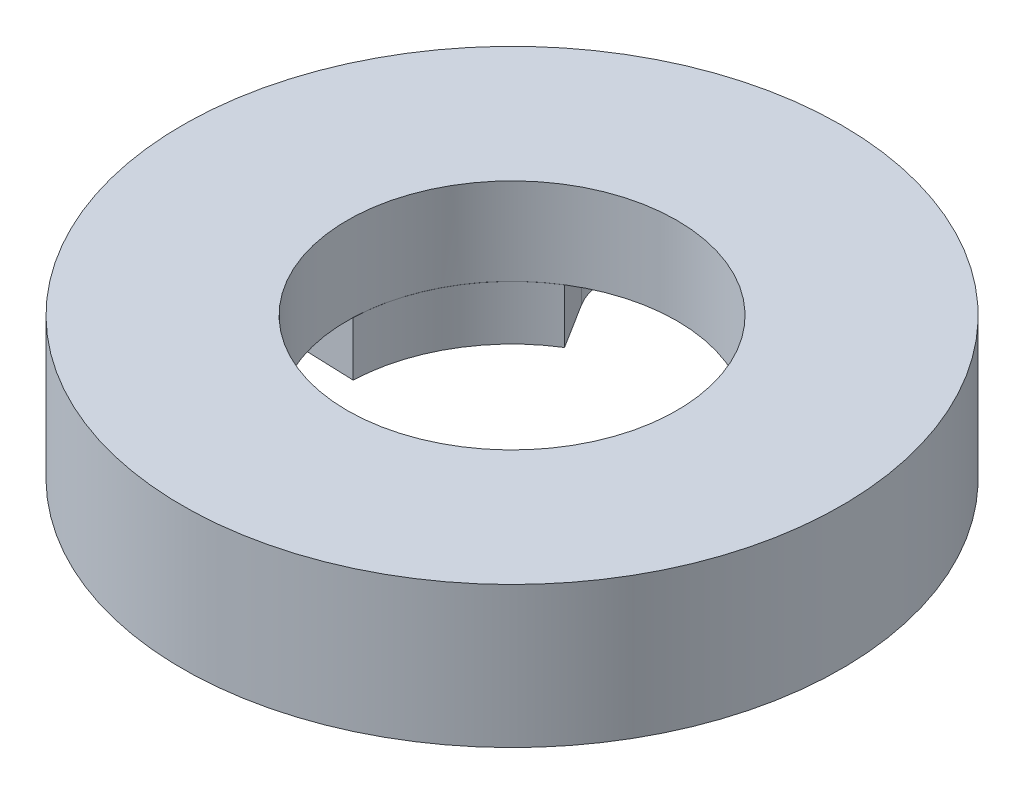
ISO-10303-21;
HEADER;
FILE_DESCRIPTION(('STEP AP214'),'2;1');
FILE_NAME('part.step','',(''),(''),'','','');
FILE_SCHEMA(('AUTOMOTIVE_DESIGN { 1 0 10303 214 1 1 1 1 }'));
ENDSEC;
DATA;
#1=APPLICATION_CONTEXT('core data for automotive mechanical design processes');
#2=APPLICATION_PROTOCOL_DEFINITION('international standard','automotive_design',2000,#1);
#3=PRODUCT_CONTEXT('',#1,'mechanical');
#4=PRODUCT('Part','Part','',(#3));
#5=PRODUCT_RELATED_PRODUCT_CATEGORY('part','',(#4));
#6=PRODUCT_DEFINITION_FORMATION('','',#4);
#7=PRODUCT_DEFINITION_CONTEXT('part definition',#1,'design');
#8=PRODUCT_DEFINITION('design','',#6,#7);
#9=PRODUCT_DEFINITION_SHAPE('','',#8);
#10=(LENGTH_UNIT() NAMED_UNIT(*) SI_UNIT(.MILLI.,.METRE.));
#11=(NAMED_UNIT(*) PLANE_ANGLE_UNIT() SI_UNIT($,.RADIAN.));
#12=(NAMED_UNIT(*) SI_UNIT($,.STERADIAN.) SOLID_ANGLE_UNIT());
#13=UNCERTAINTY_MEASURE_WITH_UNIT(LENGTH_MEASURE(1.E-05),#10,'distance_accuracy_value','');
#14=(GEOMETRIC_REPRESENTATION_CONTEXT(3) GLOBAL_UNCERTAINTY_ASSIGNED_CONTEXT((#13)) GLOBAL_UNIT_ASSIGNED_CONTEXT((#10,
#11,#12)) REPRESENTATION_CONTEXT('',''));
#15=CARTESIAN_POINT('',(0.,0.,0.));
#16=DIRECTION('',(0.,0.,1.));
#17=DIRECTION('',(1.,0.,0.));
#18=AXIS2_PLACEMENT_3D('',#15,#16,#17);
#19=CARTESIAN_POINT('',(0.,-5.8674,0.));
#20=DIRECTION('',(0.,1.,0.));
#21=DIRECTION('',(0.,0.,1.));
#22=AXIS2_PLACEMENT_3D('',#19,#20,#21);
#23=PLANE('',#22);
#24=CARTESIAN_POINT('',(0.,-5.8674,0.));
#25=DIRECTION('',(0.,-1.,0.));
#26=DIRECTION('',(0.,0.,-1.));
#27=AXIS2_PLACEMENT_3D('',#24,#25,#26);
#28=CIRCLE('',#27,11.1125);
#29=CARTESIAN_POINT('',(11.1057305652497,-5.8674,-0.387820657106539));
#30=VERTEX_POINT('',#29);
#31=CARTESIAN_POINT('',(5.8887278237915,-5.8674,-9.42393446853828));
#32=VERTEX_POINT('',#31);
#33=EDGE_CURVE('E321',#30,#32,#28,.F.);
#34=ORIENTED_EDGE('',*,*,#33,.T.);
#35=DIRECTION('',(-0.529919264233206,0.,0.848048096156426));
#36=VECTOR('',#35,1.);
#37=CARTESIAN_POINT('',(2.15404216423732,-5.8674,-3.44718805243929));
#38=LINE('',#37,#36);
#39=CARTESIAN_POINT('',(5.88536283646362,-5.8674,-9.41854936312769));
#40=VERTEX_POINT('',#39);
#41=EDGE_CURVE('E191',#40,#32,#38,.F.);
#42=ORIENTED_EDGE('',*,*,#41,.F.);
#43=CARTESIAN_POINT('',(0.,-5.8674,0.));
#44=DIRECTION('',(0.,1.,0.));
#45=DIRECTION('',(0.,0.,1.));
#46=AXIS2_PLACEMENT_3D('',#43,#44,#45);
#47=CIRCLE('',#46,11.10615);
#48=CARTESIAN_POINT('',(11.0993844334981,-5.8674,-0.387599045302477));
#49=VERTEX_POINT('',#48);
#50=EDGE_CURVE('E181',#40,#49,#47,.F.);
#51=ORIENTED_EDGE('',*,*,#50,.T.);
#52=DIRECTION('',(0.999390827019096,0.,-0.0348994967025008));
#53=VECTOR('',#52,1.);
#54=CARTESIAN_POINT('',(19.0383952547138,-5.8674,-0.664835412182639));
#55=LINE('',#54,#53);
#56=EDGE_CURVE('E175',#30,#49,#55,.F.);
#57=ORIENTED_EDGE('',*,*,#56,.F.);
#58=EDGE_LOOP('',(#34,#42,#51,#57));
#59=FACE_BOUND('',#58,.T.);
#60=ADVANCED_FACE('F17',(#59),#23,.T.);
#61=CARTESIAN_POINT('',(0.,-5.8674,0.));
#62=DIRECTION('',(0.,1.,0.));
#63=DIRECTION('',(0.,0.,1.));
#64=AXIS2_PLACEMENT_3D('',#61,#62,#63);
#65=PLANE('',#64);
#66=CARTESIAN_POINT('',(4.58846068229295,-5.8674,-14.5328465404081));
#67=DIRECTION('',(0.,-1.,0.));
#68=DIRECTION('',(0.,0.,-1.));
#69=AXIS2_PLACEMENT_3D('',#66,#67,#68);
#70=CIRCLE('',#69,3.81);
#71=CARTESIAN_POINT('',(5.73557585286619,-5.8674,-18.1660581755101));
#72=VERTEX_POINT('',#71);
#73=CARTESIAN_POINT('',(7.81952392864893,-5.8674,-12.5138541436796));
#74=VERTEX_POINT('',#73);
#75=EDGE_CURVE('E199',#72,#74,#70,.T.);
#76=ORIENTED_EDGE('',*,*,#75,.T.);
#77=DIRECTION('',(-0.529919264233206,0.,0.848048096156426));
#78=VECTOR('',#77,1.);
#79=CARTESIAN_POINT('',(2.15404216423732,-5.8674,-3.44718805243929));
#80=LINE('',#79,#78);
#81=EDGE_CURVE('E195',#32,#74,#80,.F.);
#82=ORIENTED_EDGE('',*,*,#81,.F.);
#83=CARTESIAN_POINT('',(0.,-5.8674,0.));
#84=DIRECTION('',(0.,-1.,0.));
#85=DIRECTION('',(0.,0.,-1.));
#86=AXIS2_PLACEMENT_3D('',#83,#84,#85);
#87=CIRCLE('',#86,11.1125);
#88=CARTESIAN_POINT('',(-5.88872782379151,-5.8674,-9.42393446853827));
#89=VERTEX_POINT('',#88);
#90=EDGE_CURVE('E318',#32,#89,#87,.F.);
#91=ORIENTED_EDGE('',*,*,#90,.T.);
#92=DIRECTION('',(-0.529919264233206,0.,-0.848048096156425));
#93=VECTOR('',#92,1.);
#94=CARTESIAN_POINT('',(-10.0949619836426,-5.8674,-16.1553162317799));
#95=LINE('',#94,#93);
#96=CARTESIAN_POINT('',(-7.81952392864895,-5.8674,-12.5138541436796));
#97=VERTEX_POINT('',#96);
#98=EDGE_CURVE('E258',#97,#89,#95,.F.);
#99=ORIENTED_EDGE('',*,*,#98,.F.);
#100=CARTESIAN_POINT('',(-4.58846068229295,-5.8674,-14.5328465404081));
#101=DIRECTION('',(0.,-1.,0.));
#102=DIRECTION('',(0.,0.,-1.));
#103=AXIS2_PLACEMENT_3D('',#100,#101,#102);
#104=CIRCLE('',#103,3.81);
#105=CARTESIAN_POINT('',(-5.7355758528662,-5.8674,-18.1660581755101));
#106=VERTEX_POINT('',#105);
#107=EDGE_CURVE('E204',#97,#106,#104,.T.);
#108=ORIENTED_EDGE('',*,*,#107,.T.);
#109=CARTESIAN_POINT('',(0.,-5.8674,0.));
#110=DIRECTION('',(0.,-1.,0.));
#111=DIRECTION('',(0.,0.,-1.));
#112=AXIS2_PLACEMENT_3D('',#109,#110,#111);
#113=CIRCLE('',#112,19.05);
#114=EDGE_CURVE('E200',#106,#72,#113,.T.);
#115=ORIENTED_EDGE('',*,*,#114,.T.);
#116=EDGE_LOOP('',(#76,#82,#91,#99,#108,#115));
#117=FACE_BOUND('',#116,.T.);
#118=ADVANCED_FACE('F380',(#117),#65,.F.);
#119=CARTESIAN_POINT('',(0.,-5.8674,0.));
#120=DIRECTION('',(0.,1.,0.));
#121=DIRECTION('',(0.,0.,1.));
#122=AXIS2_PLACEMENT_3D('',#119,#120,#121);
#123=PLANE('',#122);
#124=CARTESIAN_POINT('',(0.,-5.8674,0.));
#125=DIRECTION('',(0.,-1.,0.));
#126=DIRECTION('',(0.,0.,-1.));
#127=AXIS2_PLACEMENT_3D('',#124,#125,#126);
#128=CIRCLE('',#127,11.1125);
#129=CARTESIAN_POINT('',(-11.1057305652497,-5.8674,-0.387820657106539));
#130=VERTEX_POINT('',#129);
#131=EDGE_CURVE('E315',#89,#130,#128,.F.);
#132=ORIENTED_EDGE('',*,*,#131,.T.);
#133=DIRECTION('',(0.999390827019096,0.,0.0348994967025009));
#134=VECTOR('',#133,1.);
#135=CARTESIAN_POINT('',(-4.0623735071533,-5.8674,-0.141861208832684));
#136=LINE('',#135,#134);
#137=CARTESIAN_POINT('',(-11.0993844334981,-5.8674,-0.387599045302481));
#138=VERTEX_POINT('',#137);
#139=EDGE_CURVE('E216',#138,#130,#136,.F.);
#140=ORIENTED_EDGE('',*,*,#139,.F.);
#141=CARTESIAN_POINT('',(0.,-5.8674,0.));
#142=DIRECTION('',(0.,1.,0.));
#143=DIRECTION('',(0.,0.,1.));
#144=AXIS2_PLACEMENT_3D('',#141,#142,#143);
#145=CIRCLE('',#144,11.10615);
#146=CARTESIAN_POINT('',(-5.88536283646364,-5.8674,-9.41854936312767));
#147=VERTEX_POINT('',#146);
#148=EDGE_CURVE('E215',#138,#147,#145,.F.);
#149=ORIENTED_EDGE('',*,*,#148,.T.);
#150=DIRECTION('',(-0.529919264233206,0.,-0.848048096156425));
#151=VECTOR('',#150,1.);
#152=CARTESIAN_POINT('',(-10.0949619836426,-5.8674,-16.1553162317799));
#153=LINE('',#152,#151);
#154=EDGE_CURVE('E211',#89,#147,#153,.F.);
#155=ORIENTED_EDGE('',*,*,#154,.F.);
#156=EDGE_LOOP('',(#132,#140,#149,#155));
#157=FACE_BOUND('',#156,.T.);
#158=ADVANCED_FACE('F364',(#157),#123,.T.);
#159=CARTESIAN_POINT('',(0.,-5.8674,0.));
#160=DIRECTION('',(0.,1.,0.));
#161=DIRECTION('',(0.,0.,1.));
#162=AXIS2_PLACEMENT_3D('',#159,#160,#161);
#163=PLANE('',#162);
#164=CARTESIAN_POINT('',(-10.2915839521477,-5.8674,11.2401467853358));
#165=DIRECTION('',(0.,-1.,0.));
#166=DIRECTION('',(0.,0.,-1.));
#167=AXIS2_PLACEMENT_3D('',#164,#165,#166);
#168=CIRCLE('',#167,3.81);
#169=CARTESIAN_POINT('',(-6.92755362335522,-5.8674,13.0288334395501));
#170=VERTEX_POINT('',#169);
#171=CARTESIAN_POINT('',(-12.8644799401847,-5.8674,14.0501834816698));
#172=VERTEX_POINT('',#171);
#173=EDGE_CURVE('E229',#170,#172,#168,.T.);
#174=ORIENTED_EDGE('',*,*,#173,.T.);
#175=CARTESIAN_POINT('',(0.,-5.8674,0.));
#176=DIRECTION('',(0.,-1.,0.));
#177=DIRECTION('',(0.,0.,-1.));
#178=AXIS2_PLACEMENT_3D('',#175,#176,#177);
#179=CIRCLE('',#178,19.05);
#180=CARTESIAN_POINT('',(-18.6000557930509,-5.8674,4.11587469384037));
#181=VERTEX_POINT('',#180);
#182=EDGE_CURVE('E225',#172,#181,#179,.T.);
#183=ORIENTED_EDGE('',*,*,#182,.T.);
#184=CARTESIAN_POINT('',(-14.8800446344407,-5.8674,3.29269975507229));
#185=DIRECTION('',(0.,-1.,0.));
#186=DIRECTION('',(0.,0.,-1.));
#187=AXIS2_PLACEMENT_3D('',#184,#185,#186);
#188=CIRCLE('',#187,3.81);
#189=CARTESIAN_POINT('',(-14.7470775520042,-5.8674,-0.514979295870466));
#190=VERTEX_POINT('',#189);
#191=EDGE_CURVE('E224',#181,#190,#188,.T.);
#192=ORIENTED_EDGE('',*,*,#191,.T.);
#193=DIRECTION('',(0.999390827019096,0.,0.0348994967025009));
#194=VECTOR('',#193,1.);
#195=CARTESIAN_POINT('',(-4.0623735071533,-5.8674,-0.141861208832684));
#196=LINE('',#195,#194);
#197=EDGE_CURVE('E220',#130,#190,#196,.F.);
#198=ORIENTED_EDGE('',*,*,#197,.F.);
#199=CARTESIAN_POINT('',(0.,-5.8674,0.));
#200=DIRECTION('',(0.,-1.,0.));
#201=DIRECTION('',(0.,0.,-1.));
#202=AXIS2_PLACEMENT_3D('',#199,#200,#201);
#203=CIRCLE('',#202,11.1125);
#204=CARTESIAN_POINT('',(-5.21700274145821,-5.8674,9.81175512564482));
#205=VERTEX_POINT('',#204);
#206=EDGE_CURVE('E312',#130,#205,#203,.F.);
#207=ORIENTED_EDGE('',*,*,#206,.T.);
#208=DIRECTION('',(-0.469471562785891,0.,0.882947592858927));
#209=VECTOR('',#208,1.);
#210=CARTESIAN_POINT('',(-1.90833134291598,-5.8674,3.58904926127198));
#211=LINE('',#210,#209);
#212=EDGE_CURVE('E240',#170,#205,#211,.F.);
#213=ORIENTED_EDGE('',*,*,#212,.F.);
#214=EDGE_LOOP('',(#174,#183,#192,#198,#207,#213));
#215=FACE_BOUND('',#214,.T.);
#216=ADVANCED_FACE('F361',(#215),#163,.F.);
#217=CARTESIAN_POINT('',(0.,-5.8674,0.));
#218=DIRECTION('',(0.,1.,0.));
#219=DIRECTION('',(0.,0.,1.));
#220=AXIS2_PLACEMENT_3D('',#217,#218,#219);
#221=PLANE('',#220);
#222=CARTESIAN_POINT('',(0.,-5.8674,0.));
#223=DIRECTION('',(0.,-1.,0.));
#224=DIRECTION('',(0.,0.,-1.));
#225=AXIS2_PLACEMENT_3D('',#222,#223,#224);
#226=CIRCLE('',#225,11.1125);
#227=CARTESIAN_POINT('',(5.2170027414582,-5.8674,9.81175512564483));
#228=VERTEX_POINT('',#227);
#229=EDGE_CURVE('E309',#205,#228,#226,.F.);
#230=ORIENTED_EDGE('',*,*,#229,.T.);
#231=DIRECTION('',(-0.46947156278589,0.,-0.882947592858927));
#232=VECTOR('',#231,1.);
#233=CARTESIAN_POINT('',(8.94343327107121,-5.8674,16.8201516439626));
#234=LINE('',#233,#232);
#235=CARTESIAN_POINT('',(5.21402159703451,-5.8674,9.80614840843018));
#236=VERTEX_POINT('',#235);
#237=EDGE_CURVE('E245',#236,#228,#234,.F.);
#238=ORIENTED_EDGE('',*,*,#237,.F.);
#239=CARTESIAN_POINT('',(0.,-5.8674,0.));
#240=DIRECTION('',(0.,1.,0.));
#241=DIRECTION('',(0.,0.,1.));
#242=AXIS2_PLACEMENT_3D('',#239,#240,#241);
#243=CIRCLE('',#242,11.10615);
#244=CARTESIAN_POINT('',(-5.21402159703452,-5.8674,9.80614840843016));
#245=VERTEX_POINT('',#244);
#246=EDGE_CURVE('E241',#236,#245,#243,.F.);
#247=ORIENTED_EDGE('',*,*,#246,.T.);
#248=DIRECTION('',(-0.469471562785891,0.,0.882947592858927));
#249=VECTOR('',#248,1.);
#250=CARTESIAN_POINT('',(-1.90833134291598,-5.8674,3.58904926127198));
#251=LINE('',#250,#249);
#252=EDGE_CURVE('E236',#205,#245,#251,.F.);
#253=ORIENTED_EDGE('',*,*,#252,.F.);
#254=EDGE_LOOP('',(#230,#238,#247,#253));
#255=FACE_BOUND('',#254,.T.);
#256=ADVANCED_FACE('F352',(#255),#221,.T.);
#257=CARTESIAN_POINT('',(0.,-5.8674,0.));
#258=DIRECTION('',(0.,1.,0.));
#259=DIRECTION('',(0.,0.,1.));
#260=AXIS2_PLACEMENT_3D('',#257,#258,#259);
#261=PLANE('',#260);
#262=CARTESIAN_POINT('',(10.2915839521477,-5.8674,11.2401467853358));
#263=DIRECTION('',(0.,-1.,0.));
#264=DIRECTION('',(0.,0.,-1.));
#265=AXIS2_PLACEMENT_3D('',#262,#263,#264);
#266=CIRCLE('',#265,3.81);
#267=CARTESIAN_POINT('',(12.8644799401847,-5.8674,14.0501834816698));
#268=VERTEX_POINT('',#267);
#269=CARTESIAN_POINT('',(6.92755362335521,-5.8674,13.0288334395501));
#270=VERTEX_POINT('',#269);
#271=EDGE_CURVE('E250',#268,#270,#266,.T.);
#272=ORIENTED_EDGE('',*,*,#271,.T.);
#273=DIRECTION('',(-0.46947156278589,0.,-0.882947592858927));
#274=VECTOR('',#273,1.);
#275=CARTESIAN_POINT('',(8.94343327107121,-5.8674,16.8201516439626));
#276=LINE('',#275,#274);
#277=EDGE_CURVE('E246',#228,#270,#276,.F.);
#278=ORIENTED_EDGE('',*,*,#277,.F.);
#279=CARTESIAN_POINT('',(0.,-5.8674,0.));
#280=DIRECTION('',(0.,-1.,0.));
#281=DIRECTION('',(0.,0.,-1.));
#282=AXIS2_PLACEMENT_3D('',#279,#280,#281);
#283=CIRCLE('',#282,11.1125);
#284=EDGE_CURVE('E172',#228,#30,#283,.F.);
#285=ORIENTED_EDGE('',*,*,#284,.T.);
#286=DIRECTION('',(0.999390827019096,0.,-0.0348994967025008));
#287=VECTOR('',#286,1.);
#288=CARTESIAN_POINT('',(19.0383952547138,-5.8674,-0.664835412182639));
#289=LINE('',#288,#287);
#290=CARTESIAN_POINT('',(14.7470775520041,-5.8674,-0.514979295870459));
#291=VERTEX_POINT('',#290);
#292=EDGE_CURVE('E169',#291,#30,#289,.F.);
#293=ORIENTED_EDGE('',*,*,#292,.F.);
#294=CARTESIAN_POINT('',(14.8800446344407,-5.8674,3.29269975507229));
#295=DIRECTION('',(0.,-1.,0.));
#296=DIRECTION('',(0.,0.,-1.));
#297=AXIS2_PLACEMENT_3D('',#294,#295,#296);
#298=CIRCLE('',#297,3.81);
#299=CARTESIAN_POINT('',(18.6000557930509,-5.8674,4.11587469384037));
#300=VERTEX_POINT('',#299);
#301=EDGE_CURVE('E20',#291,#300,#298,.T.);
#302=ORIENTED_EDGE('',*,*,#301,.T.);
#303=CARTESIAN_POINT('',(0.,-5.8674,0.));
#304=DIRECTION('',(0.,-1.,0.));
#305=DIRECTION('',(0.,0.,-1.));
#306=AXIS2_PLACEMENT_3D('',#303,#304,#305);
#307=CIRCLE('',#306,19.05);
#308=EDGE_CURVE('E251',#300,#268,#307,.T.);
#309=ORIENTED_EDGE('',*,*,#308,.T.);
#310=EDGE_LOOP('',(#272,#278,#285,#293,#302,#309));
#311=FACE_BOUND('',#310,.T.);
#312=ADVANCED_FACE('F170',(#311),#261,.F.);
#313=CARTESIAN_POINT('',(14.8800446344407,-9.525,3.29269975507229));
#314=DIRECTION('',(0.,-1.,0.));
#315=DIRECTION('',(0.,0.,-1.));
#316=AXIS2_PLACEMENT_3D('',#313,#314,#315);
#317=CYLINDRICAL_SURFACE('',#316,3.81);
#318=DIRECTION('',(0.,-1.,0.));
#319=VECTOR('',#318,1.);
#320=CARTESIAN_POINT('',(18.6000557930508,-9.525,4.11587469384038));
#321=LINE('',#320,#319);
#322=CARTESIAN_POINT('',(18.6000557930509,-9.525,4.11587469384037));
#323=VERTEX_POINT('',#322);
#324=EDGE_CURVE('E164',#323,#300,#321,.F.);
#325=ORIENTED_EDGE('',*,*,#324,.T.);
#326=ORIENTED_EDGE('',*,*,#301,.F.);
#327=DIRECTION('',(0.,1.,0.));
#328=VECTOR('',#327,1.);
#329=CARTESIAN_POINT('',(14.7470775520041,-9.525,-0.514979295870458));
#330=LINE('',#329,#328);
#331=CARTESIAN_POINT('',(14.7470775520041,-9.525,-0.514979295870461));
#332=VERTEX_POINT('',#331);
#333=EDGE_CURVE('E161',#332,#291,#330,.T.);
#334=ORIENTED_EDGE('',*,*,#333,.F.);
#335=CARTESIAN_POINT('',(14.8800446344407,-9.525,3.29269975507229));
#336=DIRECTION('',(0.,-1.,0.));
#337=DIRECTION('',(0.,0.,-1.));
#338=AXIS2_PLACEMENT_3D('',#335,#336,#337);
#339=CIRCLE('',#338,3.81);
#340=EDGE_CURVE('E306',#332,#323,#339,.T.);
#341=ORIENTED_EDGE('',*,*,#340,.T.);
#342=EDGE_LOOP('',(#325,#326,#334,#341));
#343=FACE_BOUND('',#342,.T.);
#344=ADVANCED_FACE('F159',(#343),#317,.F.);
#345=CARTESIAN_POINT('',(0.,-9.525,0.));
#346=DIRECTION('',(0.,-1.,0.));
#347=DIRECTION('',(0.,0.,-1.));
#348=AXIS2_PLACEMENT_3D('',#345,#346,#347);
#349=CYLINDRICAL_SURFACE('',#348,19.05);
#350=DIRECTION('',(0.,-1.,0.));
#351=VECTOR('',#350,1.);
#352=CARTESIAN_POINT('',(12.8644799401846,-9.525,14.0501834816697));
#353=LINE('',#352,#351);
#354=CARTESIAN_POINT('',(12.8644799401847,-9.525,14.0501834816698));
#355=VERTEX_POINT('',#354);
#356=EDGE_CURVE('E247',#355,#268,#353,.F.);
#357=ORIENTED_EDGE('',*,*,#356,.T.);
#358=ORIENTED_EDGE('',*,*,#308,.F.);
#359=ORIENTED_EDGE('',*,*,#324,.F.);
#360=CARTESIAN_POINT('',(0.,-9.525,0.));
#361=DIRECTION('',(0.,-1.,0.));
#362=DIRECTION('',(0.,0.,-1.));
#363=AXIS2_PLACEMENT_3D('',#360,#361,#362);
#364=CIRCLE('',#363,19.05);
#365=EDGE_CURVE('E304',#323,#355,#364,.T.);
#366=ORIENTED_EDGE('',*,*,#365,.T.);
#367=EDGE_LOOP('',(#357,#358,#359,#366));
#368=FACE_BOUND('',#367,.T.);
#369=ADVANCED_FACE('F336',(#368),#349,.F.);
#370=CARTESIAN_POINT('',(10.2915839521477,-9.525,11.2401467853358));
#371=DIRECTION('',(0.,-1.,0.));
#372=DIRECTION('',(0.,0.,-1.));
#373=AXIS2_PLACEMENT_3D('',#370,#371,#372);
#374=CYLINDRICAL_SURFACE('',#373,3.81);
#375=DIRECTION('',(0.,1.,0.));
#376=VECTOR('',#375,1.);
#377=CARTESIAN_POINT('',(6.92755362335522,-9.525,13.0288334395501));
#378=LINE('',#377,#376);
#379=CARTESIAN_POINT('',(6.9275536233552,-9.525,13.0288334395501));
#380=VERTEX_POINT('',#379);
#381=EDGE_CURVE('E242',#270,#380,#378,.F.);
#382=ORIENTED_EDGE('',*,*,#381,.F.);
#383=ORIENTED_EDGE('',*,*,#271,.F.);
#384=ORIENTED_EDGE('',*,*,#356,.F.);
#385=CARTESIAN_POINT('',(10.2915839521477,-9.525,11.2401467853358));
#386=DIRECTION('',(0.,-1.,0.));
#387=DIRECTION('',(0.,0.,-1.));
#388=AXIS2_PLACEMENT_3D('',#385,#386,#387);
#389=CIRCLE('',#388,3.81);
#390=EDGE_CURVE('E302',#355,#380,#389,.T.);
#391=ORIENTED_EDGE('',*,*,#390,.T.);
#392=EDGE_LOOP('',(#382,#383,#384,#391));
#393=FACE_BOUND('',#392,.T.);
#394=ADVANCED_FACE('F340',(#393),#374,.F.);
#395=CARTESIAN_POINT('',(8.94343327107121,-9.525,16.8201516439626));
#396=DIRECTION('',(0.882947592858927,0.,-0.46947156278589));
#397=DIRECTION('',(-0.46947156278589,0.,-0.882947592858927));
#398=AXIS2_PLACEMENT_3D('',#395,#396,#397);
#399=PLANE('',#398);
#400=DIRECTION('',(0.,1.,0.));
#401=VECTOR('',#400,1.);
#402=CARTESIAN_POINT('',(5.21402159703452,0.,9.80614840843018));
#403=LINE('',#402,#401);
#404=CARTESIAN_POINT('',(5.21402159703452,-9.525,9.80614840843018));
#405=VERTEX_POINT('',#404);
#406=EDGE_CURVE('E237',#405,#236,#403,.T.);
#407=ORIENTED_EDGE('',*,*,#406,.T.);
#408=ORIENTED_EDGE('',*,*,#237,.T.);
#409=ORIENTED_EDGE('',*,*,#277,.T.);
#410=ORIENTED_EDGE('',*,*,#381,.T.);
#411=DIRECTION('',(-0.469471562785885,0.,-0.88294759285893));
#412=VECTOR('',#411,1.);
#413=CARTESIAN_POINT('',(6.92755362335522,-9.525,13.0288334395501));
#414=LINE('',#413,#412);
#415=EDGE_CURVE('E301',#380,#405,#414,.T.);
#416=ORIENTED_EDGE('',*,*,#415,.T.);
#417=EDGE_LOOP('',(#407,#408,#409,#410,#416));
#418=FACE_BOUND('',#417,.T.);
#419=ADVANCED_FACE('F343',(#418),#399,.T.);
#420=CARTESIAN_POINT('',(0.,0.,0.));
#421=DIRECTION('',(0.,1.,0.));
#422=DIRECTION('',(0.,0.,1.));
#423=AXIS2_PLACEMENT_3D('',#420,#421,#422);
#424=CYLINDRICAL_SURFACE('',#423,11.10615);
#425=CARTESIAN_POINT('',(0.,-9.525,0.));
#426=DIRECTION('',(0.,1.,0.));
#427=DIRECTION('',(0.,0.,1.));
#428=AXIS2_PLACEMENT_3D('',#425,#426,#427);
#429=CIRCLE('',#428,11.10615);
#430=CARTESIAN_POINT('',(-5.21402159703452,-9.525,9.80614840843016));
#431=VERTEX_POINT('',#430);
#432=EDGE_CURVE('E299',#405,#431,#429,.F.);
#433=ORIENTED_EDGE('',*,*,#432,.T.);
#434=DIRECTION('',(0.,1.,0.));
#435=VECTOR('',#434,1.);
#436=CARTESIAN_POINT('',(-5.21402159703452,-9.525,9.80614840843016));
#437=LINE('',#436,#435);
#438=EDGE_CURVE('E233',#245,#431,#437,.F.);
#439=ORIENTED_EDGE('',*,*,#438,.F.);
#440=ORIENTED_EDGE('',*,*,#246,.F.);
#441=ORIENTED_EDGE('',*,*,#406,.F.);
#442=EDGE_LOOP('',(#433,#439,#440,#441));
#443=FACE_BOUND('',#442,.T.);
#444=ADVANCED_FACE('F397',(#443),#424,.F.);
#445=CARTESIAN_POINT('',(-1.90833134291598,-9.525,3.58904926127198));
#446=DIRECTION('',(-0.882947592858927,0.,-0.469471562785891));
#447=DIRECTION('',(-0.469471562785891,0.,0.882947592858927));
#448=AXIS2_PLACEMENT_3D('',#445,#446,#447);
#449=PLANE('',#448);
#450=ORIENTED_EDGE('',*,*,#252,.T.);
#451=ORIENTED_EDGE('',*,*,#438,.T.);
#452=DIRECTION('',(-0.469471562785885,0.,0.88294759285893));
#453=VECTOR('',#452,1.);
#454=CARTESIAN_POINT('',(-5.21402159703452,-9.525,9.80614840843016));
#455=LINE('',#454,#453);
#456=CARTESIAN_POINT('',(-6.92755362335521,-9.525,13.0288334395501));
#457=VERTEX_POINT('',#456);
#458=EDGE_CURVE('E298',#431,#457,#455,.T.);
#459=ORIENTED_EDGE('',*,*,#458,.T.);
#460=DIRECTION('',(0.,-1.,0.));
#461=VECTOR('',#460,1.);
#462=CARTESIAN_POINT('',(-6.92755362335522,-9.525,13.0288334395501));
#463=LINE('',#462,#461);
#464=EDGE_CURVE('E230',#457,#170,#463,.F.);
#465=ORIENTED_EDGE('',*,*,#464,.T.);
#466=ORIENTED_EDGE('',*,*,#212,.T.);
#467=EDGE_LOOP('',(#450,#451,#459,#465,#466));
#468=FACE_BOUND('',#467,.T.);
#469=ADVANCED_FACE('F356',(#468),#449,.T.);
#470=CARTESIAN_POINT('',(-10.2915839521477,-9.525,11.2401467853358));
#471=DIRECTION('',(0.,-1.,0.));
#472=DIRECTION('',(0.,0.,-1.));
#473=AXIS2_PLACEMENT_3D('',#470,#471,#472);
#474=CYLINDRICAL_SURFACE('',#473,3.81);
#475=DIRECTION('',(0.,-1.,0.));
#476=VECTOR('',#475,1.);
#477=CARTESIAN_POINT('',(-12.8644799401847,-9.525,14.0501834816698));
#478=LINE('',#477,#476);
#479=CARTESIAN_POINT('',(-12.8644799401847,-9.525,14.0501834816698));
#480=VERTEX_POINT('',#479);
#481=EDGE_CURVE('E226',#480,#172,#478,.F.);
#482=ORIENTED_EDGE('',*,*,#481,.T.);
#483=ORIENTED_EDGE('',*,*,#173,.F.);
#484=ORIENTED_EDGE('',*,*,#464,.F.);
#485=CARTESIAN_POINT('',(-10.2915839521477,-9.525,11.2401467853358));
#486=DIRECTION('',(0.,-1.,0.));
#487=DIRECTION('',(0.,0.,-1.));
#488=AXIS2_PLACEMENT_3D('',#485,#486,#487);
#489=CIRCLE('',#488,3.81);
#490=EDGE_CURVE('E296',#457,#480,#489,.T.);
#491=ORIENTED_EDGE('',*,*,#490,.T.);
#492=EDGE_LOOP('',(#482,#483,#484,#491));
#493=FACE_BOUND('',#492,.T.);
#494=ADVANCED_FACE('F401',(#493),#474,.F.);
#495=CARTESIAN_POINT('',(0.,-9.525,0.));
#496=DIRECTION('',(0.,-1.,0.));
#497=DIRECTION('',(0.,0.,-1.));
#498=AXIS2_PLACEMENT_3D('',#495,#496,#497);
#499=CYLINDRICAL_SURFACE('',#498,19.05);
#500=ORIENTED_EDGE('',*,*,#481,.F.);
#501=CARTESIAN_POINT('',(0.,-9.525,0.));
#502=DIRECTION('',(0.,-1.,0.));
#503=DIRECTION('',(0.,0.,-1.));
#504=AXIS2_PLACEMENT_3D('',#501,#502,#503);
#505=CIRCLE('',#504,19.05);
#506=CARTESIAN_POINT('',(-18.6000557930509,-9.525,4.11587469384037));
#507=VERTEX_POINT('',#506);
#508=EDGE_CURVE('E294',#480,#507,#505,.T.);
#509=ORIENTED_EDGE('',*,*,#508,.T.);
#510=DIRECTION('',(0.,-1.,0.));
#511=VECTOR('',#510,1.);
#512=CARTESIAN_POINT('',(-18.6000557930509,-9.525,4.11587469384038));
#513=LINE('',#512,#511);
#514=EDGE_CURVE('E221',#507,#181,#513,.F.);
#515=ORIENTED_EDGE('',*,*,#514,.T.);
#516=ORIENTED_EDGE('',*,*,#182,.F.);
#517=EDGE_LOOP('',(#500,#509,#515,#516));
#518=FACE_BOUND('',#517,.T.);
#519=ADVANCED_FACE('F405',(#518),#499,.F.);
#520=CARTESIAN_POINT('',(-14.8800446344407,-9.525,3.29269975507229));
#521=DIRECTION('',(0.,-1.,0.));
#522=DIRECTION('',(0.,0.,-1.));
#523=AXIS2_PLACEMENT_3D('',#520,#521,#522);
#524=CYLINDRICAL_SURFACE('',#523,3.81);
#525=DIRECTION('',(0.,1.,0.));
#526=VECTOR('',#525,1.);
#527=CARTESIAN_POINT('',(-14.7470775520042,-9.525,-0.514979295870466));
#528=LINE('',#527,#526);
#529=CARTESIAN_POINT('',(-14.7470775520042,-9.525,-0.514979295870465));
#530=VERTEX_POINT('',#529);
#531=EDGE_CURVE('E217',#190,#530,#528,.F.);
#532=ORIENTED_EDGE('',*,*,#531,.F.);
#533=ORIENTED_EDGE('',*,*,#191,.F.);
#534=ORIENTED_EDGE('',*,*,#514,.F.);
#535=CARTESIAN_POINT('',(-14.8800446344407,-9.525,3.29269975507229));
#536=DIRECTION('',(0.,-1.,0.));
#537=DIRECTION('',(0.,0.,-1.));
#538=AXIS2_PLACEMENT_3D('',#535,#536,#537);
#539=CIRCLE('',#538,3.81);
#540=EDGE_CURVE('E292',#507,#530,#539,.T.);
#541=ORIENTED_EDGE('',*,*,#540,.T.);
#542=EDGE_LOOP('',(#532,#533,#534,#541));
#543=FACE_BOUND('',#542,.T.);
#544=ADVANCED_FACE('F410',(#543),#524,.F.);
#545=CARTESIAN_POINT('',(-4.0623735071533,-9.525,-0.141861208832684));
#546=DIRECTION('',(-0.0348994967025009,0.,0.999390827019096));
#547=DIRECTION('',(0.999390827019096,0.,0.0348994967025009));
#548=AXIS2_PLACEMENT_3D('',#545,#546,#547);
#549=PLANE('',#548);
#550=DIRECTION('',(0.,1.,0.));
#551=VECTOR('',#550,1.);
#552=CARTESIAN_POINT('',(-11.0993844334981,0.,-0.38759904530248));
#553=LINE('',#552,#551);
#554=CARTESIAN_POINT('',(-11.0993844334981,-9.525,-0.387599045302481));
#555=VERTEX_POINT('',#554);
#556=EDGE_CURVE('E212',#555,#138,#553,.T.);
#557=ORIENTED_EDGE('',*,*,#556,.T.);
#558=ORIENTED_EDGE('',*,*,#139,.T.);
#559=ORIENTED_EDGE('',*,*,#197,.T.);
#560=ORIENTED_EDGE('',*,*,#531,.T.);
#561=DIRECTION('',(0.999390827019096,0.,0.0348994967025004));
#562=VECTOR('',#561,1.);
#563=CARTESIAN_POINT('',(-14.7470775520042,-9.525,-0.514979295870465));
#564=LINE('',#563,#562);
#565=EDGE_CURVE('E291',#530,#555,#564,.T.);
#566=ORIENTED_EDGE('',*,*,#565,.T.);
#567=EDGE_LOOP('',(#557,#558,#559,#560,#566));
#568=FACE_BOUND('',#567,.T.);
#569=ADVANCED_FACE('F366',(#568),#549,.T.);
#570=CARTESIAN_POINT('',(0.,0.,0.));
#571=DIRECTION('',(0.,1.,0.));
#572=DIRECTION('',(0.,0.,1.));
#573=AXIS2_PLACEMENT_3D('',#570,#571,#572);
#574=CYLINDRICAL_SURFACE('',#573,11.10615);
#575=ORIENTED_EDGE('',*,*,#148,.F.);
#576=ORIENTED_EDGE('',*,*,#556,.F.);
#577=CARTESIAN_POINT('',(0.,-9.525,0.));
#578=DIRECTION('',(0.,1.,0.));
#579=DIRECTION('',(0.,0.,1.));
#580=AXIS2_PLACEMENT_3D('',#577,#578,#579);
#581=CIRCLE('',#580,11.10615);
#582=CARTESIAN_POINT('',(-5.88536283646363,-9.525,-9.41854936312767));
#583=VERTEX_POINT('',#582);
#584=EDGE_CURVE('E289',#555,#583,#581,.F.);
#585=ORIENTED_EDGE('',*,*,#584,.T.);
#586=DIRECTION('',(0.,1.,0.));
#587=VECTOR('',#586,1.);
#588=CARTESIAN_POINT('',(-5.88536283646364,-9.525,-9.41854936312767));
#589=LINE('',#588,#587);
#590=EDGE_CURVE('E208',#147,#583,#589,.F.);
#591=ORIENTED_EDGE('',*,*,#590,.F.);
#592=EDGE_LOOP('',(#575,#576,#585,#591));
#593=FACE_BOUND('',#592,.T.);
#594=ADVANCED_FACE('F373',(#593),#574,.F.);
#595=CARTESIAN_POINT('',(-10.0949619836426,-9.525,-16.1553162317799));
#596=DIRECTION('',(0.848048096156425,0.,-0.529919264233206));
#597=DIRECTION('',(-0.529919264233206,0.,-0.848048096156425));
#598=AXIS2_PLACEMENT_3D('',#595,#596,#597);
#599=PLANE('',#598);
#600=ORIENTED_EDGE('',*,*,#154,.T.);
#601=ORIENTED_EDGE('',*,*,#590,.T.);
#602=DIRECTION('',(-0.529919264233203,0.,-0.848048096156427));
#603=VECTOR('',#602,1.);
#604=CARTESIAN_POINT('',(-5.88536283646362,-9.525,-9.41854936312768));
#605=LINE('',#604,#603);
#606=CARTESIAN_POINT('',(-7.81952392864893,-9.525,-12.5138541436796));
#607=VERTEX_POINT('',#606);
#608=EDGE_CURVE('E288',#583,#607,#605,.T.);
#609=ORIENTED_EDGE('',*,*,#608,.T.);
#610=DIRECTION('',(0.,-1.,0.));
#611=VECTOR('',#610,1.);
#612=CARTESIAN_POINT('',(-7.81952392864894,-9.525,-12.5138541436796));
#613=LINE('',#612,#611);
#614=EDGE_CURVE('E205',#607,#97,#613,.F.);
#615=ORIENTED_EDGE('',*,*,#614,.T.);
#616=ORIENTED_EDGE('',*,*,#98,.T.);
#617=EDGE_LOOP('',(#600,#601,#609,#615,#616));
#618=FACE_BOUND('',#617,.T.);
#619=ADVANCED_FACE('F376',(#618),#599,.T.);
#620=CARTESIAN_POINT('',(-4.58846068229295,-9.525,-14.5328465404081));
#621=DIRECTION('',(0.,-1.,0.));
#622=DIRECTION('',(0.,0.,-1.));
#623=AXIS2_PLACEMENT_3D('',#620,#621,#622);
#624=CYLINDRICAL_SURFACE('',#623,3.81);
#625=DIRECTION('',(0.,-1.,0.));
#626=VECTOR('',#625,1.);
#627=CARTESIAN_POINT('',(-5.7355758528662,-9.525,-18.1660581755101));
#628=LINE('',#627,#626);
#629=CARTESIAN_POINT('',(-5.7355758528662,-9.525,-18.1660581755101));
#630=VERTEX_POINT('',#629);
#631=EDGE_CURVE('E201',#630,#106,#628,.F.);
#632=ORIENTED_EDGE('',*,*,#631,.T.);
#633=ORIENTED_EDGE('',*,*,#107,.F.);
#634=ORIENTED_EDGE('',*,*,#614,.F.);
#635=CARTESIAN_POINT('',(-4.58846068229295,-9.525,-14.5328465404081));
#636=DIRECTION('',(0.,-1.,0.));
#637=DIRECTION('',(0.,0.,-1.));
#638=AXIS2_PLACEMENT_3D('',#635,#636,#637);
#639=CIRCLE('',#638,3.81);
#640=EDGE_CURVE('E286',#607,#630,#639,.T.);
#641=ORIENTED_EDGE('',*,*,#640,.T.);
#642=EDGE_LOOP('',(#632,#633,#634,#641));
#643=FACE_BOUND('',#642,.T.);
#644=ADVANCED_FACE('F415',(#643),#624,.F.);
#645=CARTESIAN_POINT('',(0.,-9.525,0.));
#646=DIRECTION('',(0.,-1.,0.));
#647=DIRECTION('',(0.,0.,-1.));
#648=AXIS2_PLACEMENT_3D('',#645,#646,#647);
#649=CYLINDRICAL_SURFACE('',#648,19.05);
#650=DIRECTION('',(0.,-1.,0.));
#651=VECTOR('',#650,1.);
#652=CARTESIAN_POINT('',(5.7355758528662,-9.525,-18.1660581755101));
#653=LINE('',#652,#651);
#654=CARTESIAN_POINT('',(5.73557585286619,-9.525,-18.1660581755101));
#655=VERTEX_POINT('',#654);
#656=EDGE_CURVE('E196',#655,#72,#653,.F.);
#657=ORIENTED_EDGE('',*,*,#656,.T.);
#658=ORIENTED_EDGE('',*,*,#114,.F.);
#659=ORIENTED_EDGE('',*,*,#631,.F.);
#660=CARTESIAN_POINT('',(0.,-9.525,0.));
#661=DIRECTION('',(0.,-1.,0.));
#662=DIRECTION('',(0.,0.,-1.));
#663=AXIS2_PLACEMENT_3D('',#660,#661,#662);
#664=CIRCLE('',#663,19.05);
#665=EDGE_CURVE('E284',#630,#655,#664,.T.);
#666=ORIENTED_EDGE('',*,*,#665,.T.);
#667=EDGE_LOOP('',(#657,#658,#659,#666));
#668=FACE_BOUND('',#667,.T.);
#669=ADVANCED_FACE('F419',(#668),#649,.F.);
#670=CARTESIAN_POINT('',(4.58846068229295,-9.525,-14.5328465404081));
#671=DIRECTION('',(0.,-1.,0.));
#672=DIRECTION('',(0.,0.,-1.));
#673=AXIS2_PLACEMENT_3D('',#670,#671,#672);
#674=CYLINDRICAL_SURFACE('',#673,3.81);
#675=DIRECTION('',(0.,1.,0.));
#676=VECTOR('',#675,1.);
#677=CARTESIAN_POINT('',(7.81952392864894,-9.525,-12.5138541436796));
#678=LINE('',#677,#676);
#679=CARTESIAN_POINT('',(7.81952392864893,-9.525,-12.5138541436796));
#680=VERTEX_POINT('',#679);
#681=EDGE_CURVE('E192',#74,#680,#678,.F.);
#682=ORIENTED_EDGE('',*,*,#681,.F.);
#683=ORIENTED_EDGE('',*,*,#75,.F.);
#684=ORIENTED_EDGE('',*,*,#656,.F.);
#685=CARTESIAN_POINT('',(4.58846068229295,-9.525,-14.5328465404081));
#686=DIRECTION('',(0.,-1.,0.));
#687=DIRECTION('',(0.,0.,-1.));
#688=AXIS2_PLACEMENT_3D('',#685,#686,#687);
#689=CIRCLE('',#688,3.81);
#690=EDGE_CURVE('E282',#655,#680,#689,.T.);
#691=ORIENTED_EDGE('',*,*,#690,.T.);
#692=EDGE_LOOP('',(#682,#683,#684,#691));
#693=FACE_BOUND('',#692,.T.);
#694=ADVANCED_FACE('F424',(#693),#674,.F.);
#695=CARTESIAN_POINT('',(2.15404216423732,-9.525,-3.44718805243929));
#696=DIRECTION('',(-0.848048096156426,0.,-0.529919264233206));
#697=DIRECTION('',(-0.529919264233206,0.,0.848048096156426));
#698=AXIS2_PLACEMENT_3D('',#695,#696,#697);
#699=PLANE('',#698);
#700=DIRECTION('',(0.,1.,0.));
#701=VECTOR('',#700,1.);
#702=CARTESIAN_POINT('',(5.88536283646362,0.,-9.41854936312769));
#703=LINE('',#702,#701);
#704=CARTESIAN_POINT('',(5.88536283646362,-9.525,-9.41854936312769));
#705=VERTEX_POINT('',#704);
#706=EDGE_CURVE('E183',#705,#40,#703,.T.);
#707=ORIENTED_EDGE('',*,*,#706,.T.);
#708=ORIENTED_EDGE('',*,*,#41,.T.);
#709=ORIENTED_EDGE('',*,*,#81,.T.);
#710=ORIENTED_EDGE('',*,*,#681,.T.);
#711=DIRECTION('',(-0.529919264233204,0.,0.848048096156427));
#712=VECTOR('',#711,1.);
#713=CARTESIAN_POINT('',(7.81952392864893,-9.525,-12.5138541436796));
#714=LINE('',#713,#712);
#715=EDGE_CURVE('E281',#680,#705,#714,.T.);
#716=ORIENTED_EDGE('',*,*,#715,.T.);
#717=EDGE_LOOP('',(#707,#708,#709,#710,#716));
#718=FACE_BOUND('',#717,.T.);
#719=ADVANCED_FACE('F383',(#718),#699,.T.);
#720=CARTESIAN_POINT('',(0.,0.,0.));
#721=DIRECTION('',(0.,1.,0.));
#722=DIRECTION('',(0.,0.,1.));
#723=AXIS2_PLACEMENT_3D('',#720,#721,#722);
#724=CYLINDRICAL_SURFACE('',#723,11.10615);
#725=ORIENTED_EDGE('',*,*,#50,.F.);
#726=ORIENTED_EDGE('',*,*,#706,.F.);
#727=CARTESIAN_POINT('',(0.,-9.525,0.));
#728=DIRECTION('',(0.,1.,0.));
#729=DIRECTION('',(0.,0.,1.));
#730=AXIS2_PLACEMENT_3D('',#727,#728,#729);
#731=CIRCLE('',#730,11.10615);
#732=CARTESIAN_POINT('',(11.0993844334981,-9.525,-0.387599045302478));
#733=VERTEX_POINT('',#732);
#734=EDGE_CURVE('E35',#705,#733,#731,.F.);
#735=ORIENTED_EDGE('',*,*,#734,.T.);
#736=DIRECTION('',(0.,1.,0.));
#737=VECTOR('',#736,1.);
#738=CARTESIAN_POINT('',(11.0993844334981,-9.525,-0.387599045302476));
#739=LINE('',#738,#737);
#740=EDGE_CURVE('E187',#49,#733,#739,.F.);
#741=ORIENTED_EDGE('',*,*,#740,.F.);
#742=EDGE_LOOP('',(#725,#726,#735,#741));
#743=FACE_BOUND('',#742,.T.);
#744=ADVANCED_FACE('F386',(#743),#724,.F.);
#745=CARTESIAN_POINT('',(19.0383952547138,-9.525,-0.664835412182639));
#746=DIRECTION('',(0.0348994967025008,0.,0.999390827019096));
#747=DIRECTION('',(0.999390827019096,0.,-0.0348994967025008));
#748=AXIS2_PLACEMENT_3D('',#745,#746,#747);
#749=PLANE('',#748);
#750=ORIENTED_EDGE('',*,*,#56,.T.);
#751=ORIENTED_EDGE('',*,*,#740,.T.);
#752=DIRECTION('',(0.999390827019096,0.,-0.0348994967025008));
#753=VECTOR('',#752,1.);
#754=CARTESIAN_POINT('',(11.0993844334981,-9.525,-0.387599045302479));
#755=LINE('',#754,#753);
#756=EDGE_CURVE('E179',#733,#332,#755,.T.);
#757=ORIENTED_EDGE('',*,*,#756,.T.);
#758=ORIENTED_EDGE('',*,*,#333,.T.);
#759=ORIENTED_EDGE('',*,*,#292,.T.);
#760=EDGE_LOOP('',(#750,#751,#757,#758,#759));
#761=FACE_BOUND('',#760,.T.);
#762=ADVANCED_FACE('F177',(#761),#749,.T.);
#763=CARTESIAN_POINT('',(0.,-5.8674,0.));
#764=DIRECTION('',(0.,-1.,0.));
#765=DIRECTION('',(0.,0.,-1.));
#766=AXIS2_PLACEMENT_3D('',#763,#764,#765);
#767=CYLINDRICAL_SURFACE('',#766,11.1125);
#768=ORIENTED_EDGE('',*,*,#229,.F.);
#769=ORIENTED_EDGE('',*,*,#206,.F.);
#770=ORIENTED_EDGE('',*,*,#131,.F.);
#771=ORIENTED_EDGE('',*,*,#90,.F.);
#772=ORIENTED_EDGE('',*,*,#33,.F.);
#773=ORIENTED_EDGE('',*,*,#284,.F.);
#774=EDGE_LOOP('',(#768,#769,#770,#771,#772,#773));
#775=FACE_BOUND('',#774,.T.);
#776=CARTESIAN_POINT('',(0.,0.,0.));
#777=DIRECTION('',(0.,-1.,0.));
#778=DIRECTION('',(0.,0.,-1.));
#779=AXIS2_PLACEMENT_3D('',#776,#777,#778);
#780=CIRCLE('',#779,11.1125);
#781=CARTESIAN_POINT('',(0.,0.,-11.1125));
#782=VERTEX_POINT('',#781);
#783=EDGE_CURVE('E277',#782,#782,#780,.T.);
#784=ORIENTED_EDGE('',*,*,#783,.F.);
#785=EDGE_LOOP('',(#784));
#786=FACE_BOUND('',#785,.T.);
#787=ADVANCED_FACE('F347',(#775,#786),#767,.F.);
#788=CARTESIAN_POINT('',(0.,-9.525,0.));
#789=DIRECTION('',(0.,1.,0.));
#790=DIRECTION('',(0.,0.,1.));
#791=AXIS2_PLACEMENT_3D('',#788,#789,#790);
#792=PLANE('',#791);
#793=CARTESIAN_POINT('',(0.,-9.525,0.));
#794=DIRECTION('',(0.,-1.,0.));
#795=DIRECTION('',(0.,0.,-1.));
#796=AXIS2_PLACEMENT_3D('',#793,#794,#795);
#797=CIRCLE('',#796,22.225);
#798=CARTESIAN_POINT('',(0.,-9.525,-22.225));
#799=VERTEX_POINT('',#798);
#800=EDGE_CURVE('E26',#799,#799,#797,.F.);
#801=ORIENTED_EDGE('',*,*,#800,.F.);
#802=EDGE_LOOP('',(#801));
#803=FACE_BOUND('',#802,.T.);
#804=ORIENTED_EDGE('',*,*,#734,.F.);
#805=ORIENTED_EDGE('',*,*,#715,.F.);
#806=ORIENTED_EDGE('',*,*,#690,.F.);
#807=ORIENTED_EDGE('',*,*,#665,.F.);
#808=ORIENTED_EDGE('',*,*,#640,.F.);
#809=ORIENTED_EDGE('',*,*,#608,.F.);
#810=ORIENTED_EDGE('',*,*,#584,.F.);
#811=ORIENTED_EDGE('',*,*,#565,.F.);
#812=ORIENTED_EDGE('',*,*,#540,.F.);
#813=ORIENTED_EDGE('',*,*,#508,.F.);
#814=ORIENTED_EDGE('',*,*,#490,.F.);
#815=ORIENTED_EDGE('',*,*,#458,.F.);
#816=ORIENTED_EDGE('',*,*,#432,.F.);
#817=ORIENTED_EDGE('',*,*,#415,.F.);
#818=ORIENTED_EDGE('',*,*,#390,.F.);
#819=ORIENTED_EDGE('',*,*,#365,.F.);
#820=ORIENTED_EDGE('',*,*,#340,.F.);
#821=ORIENTED_EDGE('',*,*,#756,.F.);
#822=EDGE_LOOP('',(#804,#805,#806,#807,#808,#809,#810,#811,#812,#813,#814,#815,#816,#817,#818,
#819,#820,#821));
#823=FACE_BOUND('',#822,.T.);
#824=ADVANCED_FACE('F388',(#803,#823),#792,.F.);
#825=CARTESIAN_POINT('',(0.,0.,0.));
#826=DIRECTION('',(0.,1.,0.));
#827=DIRECTION('',(0.,0.,1.));
#828=AXIS2_PLACEMENT_3D('',#825,#826,#827);
#829=PLANE('',#828);
#830=CARTESIAN_POINT('',(0.,0.,0.));
#831=DIRECTION('',(0.,-1.,0.));
#832=DIRECTION('',(0.,0.,-1.));
#833=AXIS2_PLACEMENT_3D('',#830,#831,#832);
#834=CIRCLE('',#833,22.225);
#835=CARTESIAN_POINT('',(0.,0.,-22.225));
#836=VERTEX_POINT('',#835);
#837=EDGE_CURVE('E11',#836,#836,#834,.T.);
#838=ORIENTED_EDGE('',*,*,#837,.F.);
#839=EDGE_LOOP('',(#838));
#840=FACE_BOUND('',#839,.T.);
#841=ORIENTED_EDGE('',*,*,#783,.T.);
#842=EDGE_LOOP('',(#841));
#843=FACE_BOUND('',#842,.T.);
#844=ADVANCED_FACE('F437',(#840,#843),#829,.T.);
#845=CARTESIAN_POINT('',(0.,-9.525,0.));
#846=DIRECTION('',(0.,-1.,0.));
#847=DIRECTION('',(0.,0.,-1.));
#848=AXIS2_PLACEMENT_3D('',#845,#846,#847);
#849=CYLINDRICAL_SURFACE('',#848,22.225);
#850=ORIENTED_EDGE('',*,*,#837,.T.);
#851=EDGE_LOOP('',(#850));
#852=FACE_BOUND('',#851,.T.);
#853=ORIENTED_EDGE('',*,*,#800,.T.);
#854=EDGE_LOOP('',(#853));
#855=FACE_BOUND('',#854,.T.);
#856=ADVANCED_FACE('F435',(#852,#855),#849,.T.);
#857=CLOSED_SHELL('',(#60,#118,#158,#216,#256,#312,#344,#369,#394,#419,#444,#469,#494,#519,#544,
#569,#594,#619,#644,#669,#694,#719,#744,#762,#787,#824,#844,#856));
#858=MANIFOLD_SOLID_BREP('B1',#857);
#859=ADVANCED_BREP_SHAPE_REPRESENTATION('',(#18,#858),#14);
#860=SHAPE_DEFINITION_REPRESENTATION(#9,#859);
ENDSEC;
END-ISO-10303-21;
